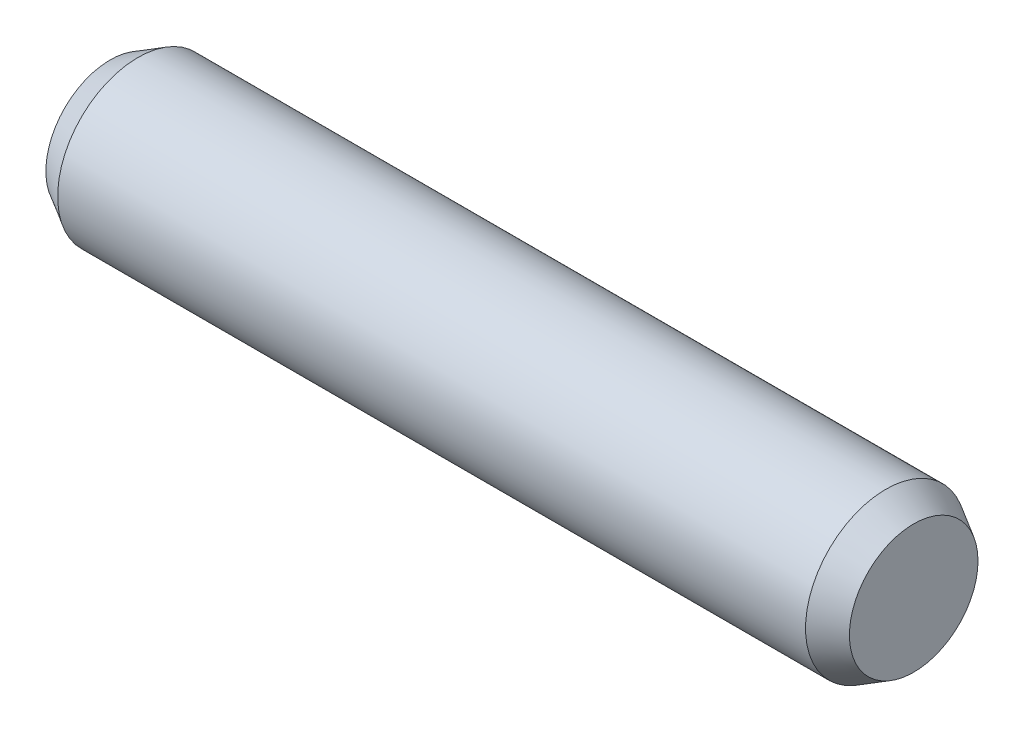
ISO-10303-21;
HEADER;
FILE_DESCRIPTION(('STEP AP214'),'2;1');
FILE_NAME('part.step','',(''),(''),'','','');
FILE_SCHEMA(('AUTOMOTIVE_DESIGN { 1 0 10303 214 1 1 1 1 }'));
ENDSEC;
DATA;
#1=APPLICATION_CONTEXT('core data for automotive mechanical design processes');
#2=APPLICATION_PROTOCOL_DEFINITION('international standard','automotive_design',2000,#1);
#3=PRODUCT_CONTEXT('',#1,'mechanical');
#4=PRODUCT('Part','Part','',(#3));
#5=PRODUCT_RELATED_PRODUCT_CATEGORY('part','',(#4));
#6=PRODUCT_DEFINITION_FORMATION('','',#4);
#7=PRODUCT_DEFINITION_CONTEXT('part definition',#1,'design');
#8=PRODUCT_DEFINITION('design','',#6,#7);
#9=PRODUCT_DEFINITION_SHAPE('','',#8);
#10=(LENGTH_UNIT() NAMED_UNIT(*) SI_UNIT(.MILLI.,.METRE.));
#11=(NAMED_UNIT(*) PLANE_ANGLE_UNIT() SI_UNIT($,.RADIAN.));
#12=(NAMED_UNIT(*) SI_UNIT($,.STERADIAN.) SOLID_ANGLE_UNIT());
#13=UNCERTAINTY_MEASURE_WITH_UNIT(LENGTH_MEASURE(1.E-05),#10,'distance_accuracy_value','');
#14=(GEOMETRIC_REPRESENTATION_CONTEXT(3) GLOBAL_UNCERTAINTY_ASSIGNED_CONTEXT((#13)) GLOBAL_UNIT_ASSIGNED_CONTEXT((#10,
#11,#12)) REPRESENTATION_CONTEXT('',''));
#15=CARTESIAN_POINT('',(0.,0.,0.));
#16=DIRECTION('',(0.,0.,1.));
#17=DIRECTION('',(1.,0.,0.));
#18=AXIS2_PLACEMENT_3D('',#15,#16,#17);
#19=CARTESIAN_POINT('',(50.,0.,0.));
#20=DIRECTION('',(-1.,0.,0.));
#21=DIRECTION('',(0.,0.,1.));
#22=AXIS2_PLACEMENT_3D('',#19,#20,#21);
#23=CYLINDRICAL_SURFACE('',#22,5.);
#24=CARTESIAN_POINT('',(48.2679491924311,0.,0.));
#25=DIRECTION('',(1.,0.,0.));
#26=DIRECTION('',(0.,0.,-1.));
#27=AXIS2_PLACEMENT_3D('',#24,#25,#26);
#28=CIRCLE('',#27,5.);
#29=CARTESIAN_POINT('',(48.2679491924311,0.,-5.));
#30=VERTEX_POINT('',#29);
#31=EDGE_CURVE('E10',#30,#30,#28,.F.);
#32=ORIENTED_EDGE('',*,*,#31,.T.);
#33=EDGE_LOOP('',(#32));
#34=FACE_BOUND('',#33,.T.);
#35=CARTESIAN_POINT('',(1.73205080756887,0.,0.));
#36=DIRECTION('',(1.,0.,0.));
#37=DIRECTION('',(0.,0.,-1.));
#38=AXIS2_PLACEMENT_3D('',#35,#36,#37);
#39=CIRCLE('',#38,5.);
#40=CARTESIAN_POINT('',(1.73205080756887,0.,-5.));
#41=VERTEX_POINT('',#40);
#42=EDGE_CURVE('E53',#41,#41,#39,.T.);
#43=ORIENTED_EDGE('',*,*,#42,.T.);
#44=EDGE_LOOP('',(#43));
#45=FACE_BOUND('',#44,.T.);
#46=ADVANCED_FACE('F37',(#34,#45),#23,.T.);
#47=CARTESIAN_POINT('',(50.,0.,0.));
#48=DIRECTION('',(1.,0.,0.));
#49=DIRECTION('',(0.,0.,-1.));
#50=AXIS2_PLACEMENT_3D('',#47,#48,#49);
#51=PLANE('',#50);
#52=CARTESIAN_POINT('',(50.,0.,0.));
#53=DIRECTION('',(1.,0.,0.));
#54=DIRECTION('',(0.,0.,-1.));
#55=AXIS2_PLACEMENT_3D('',#52,#53,#54);
#56=CIRCLE('',#55,4.);
#57=CARTESIAN_POINT('',(50.,0.,-4.));
#58=VERTEX_POINT('',#57);
#59=EDGE_CURVE('E45',#58,#58,#56,.T.);
#60=ORIENTED_EDGE('',*,*,#59,.T.);
#61=EDGE_LOOP('',(#60));
#62=FACE_BOUND('',#61,.T.);
#63=ADVANCED_FACE('F69',(#62),#51,.T.);
#64=CARTESIAN_POINT('',(0.,0.,0.));
#65=DIRECTION('',(1.,0.,0.));
#66=DIRECTION('',(0.,0.,-1.));
#67=AXIS2_PLACEMENT_3D('',#64,#65,#66);
#68=PLANE('',#67);
#69=CARTESIAN_POINT('',(0.,0.,0.));
#70=DIRECTION('',(1.,0.,0.));
#71=DIRECTION('',(0.,0.,-1.));
#72=AXIS2_PLACEMENT_3D('',#69,#70,#71);
#73=CIRCLE('',#72,4.);
#74=CARTESIAN_POINT('',(0.,0.,-4.));
#75=VERTEX_POINT('',#74);
#76=EDGE_CURVE('E49',#75,#75,#73,.F.);
#77=ORIENTED_EDGE('',*,*,#76,.T.);
#78=EDGE_LOOP('',(#77));
#79=FACE_BOUND('',#78,.T.);
#80=ADVANCED_FACE('F62',(#79),#68,.F.);
#81=CARTESIAN_POINT('',(1.73205080756887,0.,0.));
#82=DIRECTION('',(1.,0.,0.));
#83=DIRECTION('',(0.,0.,-1.));
#84=AXIS2_PLACEMENT_3D('',#81,#82,#83);
#85=CONICAL_SURFACE('',#84,5.,0.523598775598301);
#86=ORIENTED_EDGE('',*,*,#76,.F.);
#87=EDGE_LOOP('',(#86));
#88=FACE_BOUND('',#87,.T.);
#89=ORIENTED_EDGE('',*,*,#42,.F.);
#90=EDGE_LOOP('',(#89));
#91=FACE_BOUND('',#90,.T.);
#92=ADVANCED_FACE('F60',(#88,#91),#85,.T.);
#93=CARTESIAN_POINT('',(50.,0.,0.));
#94=DIRECTION('',(-1.,0.,0.));
#95=DIRECTION('',(0.,0.,1.));
#96=AXIS2_PLACEMENT_3D('',#93,#94,#95);
#97=CONICAL_SURFACE('',#96,4.,0.523598775598304);
#98=ORIENTED_EDGE('',*,*,#31,.F.);
#99=EDGE_LOOP('',(#98));
#100=FACE_BOUND('',#99,.T.);
#101=ORIENTED_EDGE('',*,*,#59,.F.);
#102=EDGE_LOOP('',(#101));
#103=FACE_BOUND('',#102,.T.);
#104=ADVANCED_FACE('F40',(#100,#103),#97,.T.);
#105=CLOSED_SHELL('',(#46,#63,#80,#92,#104));
#106=MANIFOLD_SOLID_BREP('B2',#105);
#107=ADVANCED_BREP_SHAPE_REPRESENTATION('',(#18,#106),#14);
#108=SHAPE_DEFINITION_REPRESENTATION(#9,#107);
ENDSEC;
END-ISO-10303-21;
